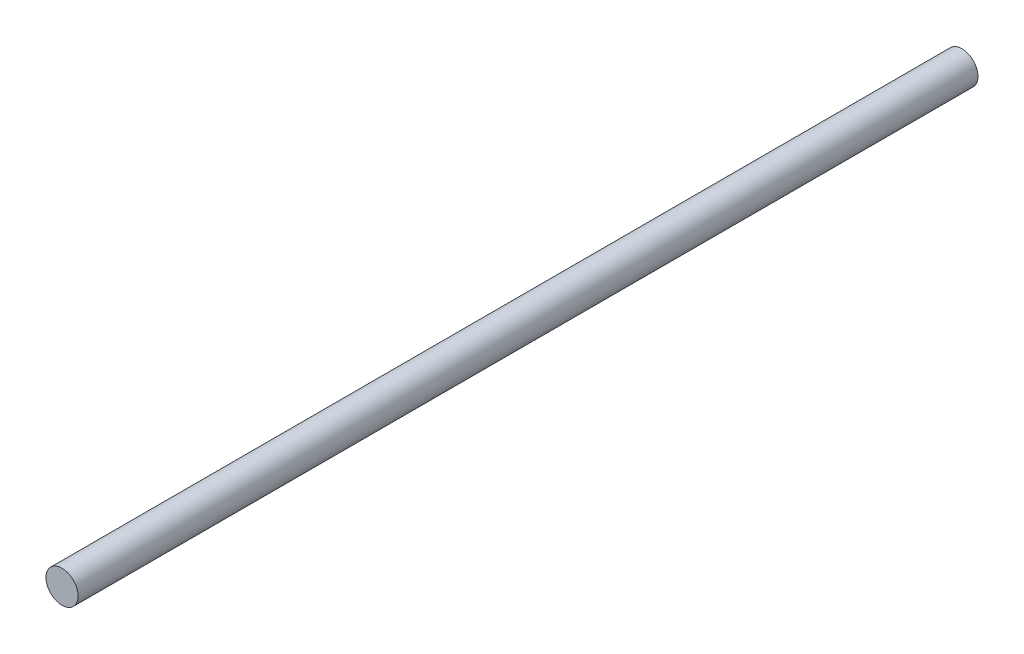
ISO-10303-21;
HEADER;
FILE_DESCRIPTION(('STEP AP214'),'2;1');
FILE_NAME('part.step','',(''),(''),'','','');
FILE_SCHEMA(('AUTOMOTIVE_DESIGN { 1 0 10303 214 1 1 1 1 }'));
ENDSEC;
DATA;
#1=APPLICATION_CONTEXT('core data for automotive mechanical design processes');
#2=APPLICATION_PROTOCOL_DEFINITION('international standard','automotive_design',2000,#1);
#3=PRODUCT_CONTEXT('',#1,'mechanical');
#4=PRODUCT('Part','Part','',(#3));
#5=PRODUCT_RELATED_PRODUCT_CATEGORY('part','',(#4));
#6=PRODUCT_DEFINITION_FORMATION('','',#4);
#7=PRODUCT_DEFINITION_CONTEXT('part definition',#1,'design');
#8=PRODUCT_DEFINITION('design','',#6,#7);
#9=PRODUCT_DEFINITION_SHAPE('','',#8);
#10=(LENGTH_UNIT() NAMED_UNIT(*) SI_UNIT(.MILLI.,.METRE.));
#11=(NAMED_UNIT(*) PLANE_ANGLE_UNIT() SI_UNIT($,.RADIAN.));
#12=(NAMED_UNIT(*) SI_UNIT($,.STERADIAN.) SOLID_ANGLE_UNIT());
#13=UNCERTAINTY_MEASURE_WITH_UNIT(LENGTH_MEASURE(1.E-05),#10,'distance_accuracy_value','');
#14=(GEOMETRIC_REPRESENTATION_CONTEXT(3) GLOBAL_UNCERTAINTY_ASSIGNED_CONTEXT((#13)) GLOBAL_UNIT_ASSIGNED_CONTEXT((#10,
#11,#12)) REPRESENTATION_CONTEXT('',''));
#15=CARTESIAN_POINT('',(0.,0.,0.));
#16=DIRECTION('',(0.,0.,1.));
#17=DIRECTION('',(1.,0.,0.));
#18=AXIS2_PLACEMENT_3D('',#15,#16,#17);
#19=CARTESIAN_POINT('',(0.,0.,112.));
#20=DIRECTION('',(0.,0.,-1.));
#21=DIRECTION('',(-1.,0.,0.));
#22=AXIS2_PLACEMENT_3D('',#19,#20,#21);
#23=CYLINDRICAL_SURFACE('',#22,4.);
#24=CARTESIAN_POINT('',(0.,0.,112.));
#25=DIRECTION('',(0.,0.,1.));
#26=DIRECTION('',(1.,0.,0.));
#27=AXIS2_PLACEMENT_3D('',#24,#25,#26);
#28=CIRCLE('',#27,4.);
#29=CARTESIAN_POINT('',(4.,0.,112.));
#30=VERTEX_POINT('',#29);
#31=EDGE_CURVE('E10',#30,#30,#28,.T.);
#32=ORIENTED_EDGE('',*,*,#31,.F.);
#33=EDGE_LOOP('',(#32));
#34=FACE_BOUND('',#33,.T.);
#35=CARTESIAN_POINT('',(0.,0.,-112.));
#36=DIRECTION('',(0.,0.,1.));
#37=DIRECTION('',(1.,0.,0.));
#38=AXIS2_PLACEMENT_3D('',#35,#36,#37);
#39=CIRCLE('',#38,4.);
#40=CARTESIAN_POINT('',(4.,0.,-112.));
#41=VERTEX_POINT('',#40);
#42=EDGE_CURVE('E37',#41,#41,#39,.T.);
#43=ORIENTED_EDGE('',*,*,#42,.T.);
#44=EDGE_LOOP('',(#43));
#45=FACE_BOUND('',#44,.T.);
#46=ADVANCED_FACE('F34',(#34,#45),#23,.T.);
#47=CARTESIAN_POINT('',(0.,0.,112.));
#48=DIRECTION('',(0.,0.,1.));
#49=DIRECTION('',(1.,0.,0.));
#50=AXIS2_PLACEMENT_3D('',#47,#48,#49);
#51=PLANE('',#50);
#52=ORIENTED_EDGE('',*,*,#31,.T.);
#53=EDGE_LOOP('',(#52));
#54=FACE_BOUND('',#53,.T.);
#55=ADVANCED_FACE('F49',(#54),#51,.T.);
#56=CARTESIAN_POINT('',(0.,0.,-112.));
#57=DIRECTION('',(0.,0.,1.));
#58=DIRECTION('',(1.,0.,0.));
#59=AXIS2_PLACEMENT_3D('',#56,#57,#58);
#60=PLANE('',#59);
#61=ORIENTED_EDGE('',*,*,#42,.F.);
#62=EDGE_LOOP('',(#61));
#63=FACE_BOUND('',#62,.T.);
#64=ADVANCED_FACE('F47',(#63),#60,.F.);
#65=CLOSED_SHELL('',(#46,#55,#64));
#66=MANIFOLD_SOLID_BREP('B2',#65);
#67=ADVANCED_BREP_SHAPE_REPRESENTATION('',(#18,#66),#14);
#68=SHAPE_DEFINITION_REPRESENTATION(#9,#67);
ENDSEC;
END-ISO-10303-21;
